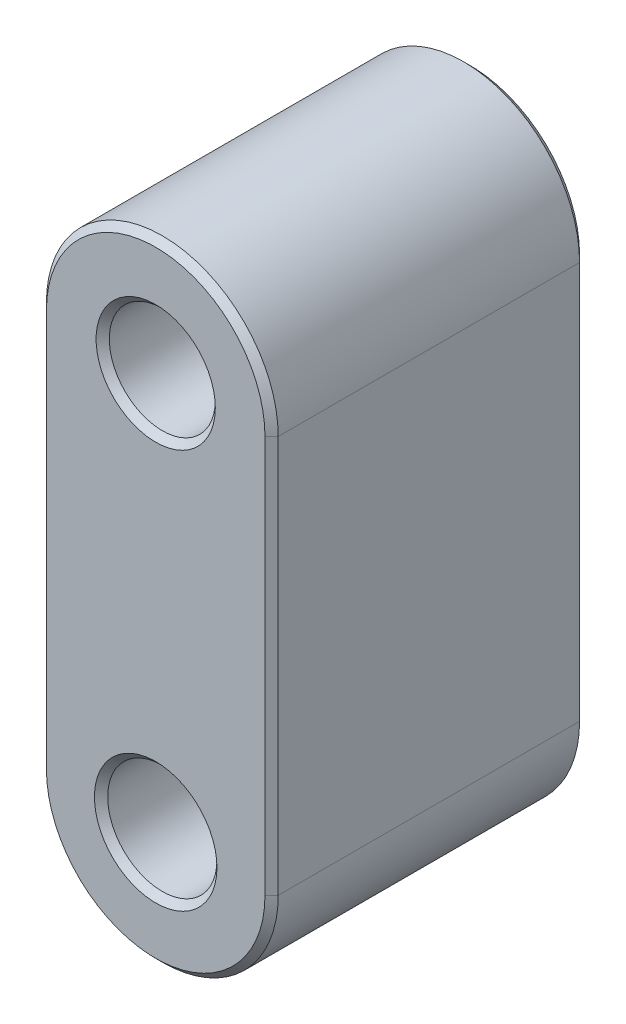
ISO-10303-21;
HEADER;
FILE_DESCRIPTION(('STEP AP214'),'2;1');
FILE_NAME('part.step','',(''),(''),'','','');
FILE_SCHEMA(('AUTOMOTIVE_DESIGN { 1 0 10303 214 1 1 1 1 }'));
ENDSEC;
DATA;
#1=APPLICATION_CONTEXT('core data for automotive mechanical design processes');
#2=APPLICATION_PROTOCOL_DEFINITION('international standard','automotive_design',2000,#1);
#3=PRODUCT_CONTEXT('',#1,'mechanical');
#4=PRODUCT('Part','Part','',(#3));
#5=PRODUCT_RELATED_PRODUCT_CATEGORY('part','',(#4));
#6=PRODUCT_DEFINITION_FORMATION('','',#4);
#7=PRODUCT_DEFINITION_CONTEXT('part definition',#1,'design');
#8=PRODUCT_DEFINITION('design','',#6,#7);
#9=PRODUCT_DEFINITION_SHAPE('','',#8);
#10=(LENGTH_UNIT() NAMED_UNIT(*) SI_UNIT(.MILLI.,.METRE.));
#11=(NAMED_UNIT(*) PLANE_ANGLE_UNIT() SI_UNIT($,.RADIAN.));
#12=(NAMED_UNIT(*) SI_UNIT($,.STERADIAN.) SOLID_ANGLE_UNIT());
#13=UNCERTAINTY_MEASURE_WITH_UNIT(LENGTH_MEASURE(1.E-05),#10,'distance_accuracy_value','');
#14=(GEOMETRIC_REPRESENTATION_CONTEXT(3) GLOBAL_UNCERTAINTY_ASSIGNED_CONTEXT((#13)) GLOBAL_UNIT_ASSIGNED_CONTEXT((#10,
#11,#12)) REPRESENTATION_CONTEXT('',''));
#15=CARTESIAN_POINT('',(0.,0.,0.));
#16=DIRECTION('',(0.,0.,1.));
#17=DIRECTION('',(1.,0.,0.));
#18=AXIS2_PLACEMENT_3D('',#15,#16,#17);
#19=CARTESIAN_POINT('',(-3.5,0.,4.75));
#20=DIRECTION('',(1.,0.,0.));
#21=DIRECTION('',(0.,0.,-1.));
#22=AXIS2_PLACEMENT_3D('',#19,#20,#21);
#23=PLANE('',#22);
#24=DIRECTION('',(0.,0.,-1.));
#25=VECTOR('',#24,1.);
#26=CARTESIAN_POINT('',(-3.5,0.,4.75));
#27=LINE('',#26,#25);
#28=CARTESIAN_POINT('',(-3.5,0.,4.55));
#29=VERTEX_POINT('',#28);
#30=CARTESIAN_POINT('',(-3.5,0.,-4.55));
#31=VERTEX_POINT('',#30);
#32=EDGE_CURVE('E167',#29,#31,#27,.T.);
#33=ORIENTED_EDGE('',*,*,#32,.T.);
#34=DIRECTION('',(0.,-1.,0.));
#35=VECTOR('',#34,1.);
#36=CARTESIAN_POINT('',(-3.5,0.,-4.55));
#37=LINE('',#36,#35);
#38=CARTESIAN_POINT('',(-3.5,-12.,-4.55));
#39=VERTEX_POINT('',#38);
#40=EDGE_CURVE('E210',#31,#39,#37,.T.);
#41=ORIENTED_EDGE('',*,*,#40,.T.);
#42=DIRECTION('',(0.,0.,-1.));
#43=VECTOR('',#42,1.);
#44=CARTESIAN_POINT('',(-3.5,-12.,4.75));
#45=LINE('',#44,#43);
#46=CARTESIAN_POINT('',(-3.5,-12.,4.55));
#47=VERTEX_POINT('',#46);
#48=EDGE_CURVE('E137',#47,#39,#45,.T.);
#49=ORIENTED_EDGE('',*,*,#48,.F.);
#50=DIRECTION('',(0.,1.,0.));
#51=VECTOR('',#50,1.);
#52=CARTESIAN_POINT('',(-3.5,0.,4.55));
#53=LINE('',#52,#51);
#54=EDGE_CURVE('E207',#47,#29,#53,.T.);
#55=ORIENTED_EDGE('',*,*,#54,.T.);
#56=EDGE_LOOP('',(#33,#41,#49,#55));
#57=FACE_BOUND('',#56,.T.);
#58=ADVANCED_FACE('F50',(#57),#23,.F.);
#59=CARTESIAN_POINT('',(0.,-12.,4.75));
#60=DIRECTION('',(0.,0.,-1.));
#61=DIRECTION('',(-1.,0.,0.));
#62=AXIS2_PLACEMENT_3D('',#59,#60,#61);
#63=CYLINDRICAL_SURFACE('',#62,3.5);
#64=ORIENTED_EDGE('',*,*,#48,.T.);
#65=CARTESIAN_POINT('',(0.,-12.,-4.55));
#66=DIRECTION('',(0.,0.,1.));
#67=DIRECTION('',(1.,0.,0.));
#68=AXIS2_PLACEMENT_3D('',#65,#66,#67);
#69=CIRCLE('',#68,3.5);
#70=CARTESIAN_POINT('',(3.5,-12.,-4.55));
#71=VERTEX_POINT('',#70);
#72=EDGE_CURVE('E140',#39,#71,#69,.T.);
#73=ORIENTED_EDGE('',*,*,#72,.T.);
#74=DIRECTION('',(0.,0.,-1.));
#75=VECTOR('',#74,1.);
#76=CARTESIAN_POINT('',(3.5,-12.,4.75));
#77=LINE('',#76,#75);
#78=CARTESIAN_POINT('',(3.5,-12.,4.55));
#79=VERTEX_POINT('',#78);
#80=EDGE_CURVE('E116',#79,#71,#77,.T.);
#81=ORIENTED_EDGE('',*,*,#80,.F.);
#82=CARTESIAN_POINT('',(0.,-12.,4.55));
#83=DIRECTION('',(0.,0.,1.));
#84=DIRECTION('',(1.,0.,0.));
#85=AXIS2_PLACEMENT_3D('',#82,#83,#84);
#86=CIRCLE('',#85,3.5);
#87=EDGE_CURVE('E134',#79,#47,#86,.F.);
#88=ORIENTED_EDGE('',*,*,#87,.T.);
#89=EDGE_LOOP('',(#64,#73,#81,#88));
#90=FACE_BOUND('',#89,.T.);
#91=ADVANCED_FACE('F131',(#90),#63,.T.);
#92=CARTESIAN_POINT('',(3.5,0.,4.75));
#93=DIRECTION('',(-1.,0.,0.));
#94=DIRECTION('',(0.,0.,1.));
#95=AXIS2_PLACEMENT_3D('',#92,#93,#94);
#96=PLANE('',#95);
#97=ORIENTED_EDGE('',*,*,#80,.T.);
#98=DIRECTION('',(0.,1.,0.));
#99=VECTOR('',#98,1.);
#100=CARTESIAN_POINT('',(3.5,0.,-4.55));
#101=LINE('',#100,#99);
#102=CARTESIAN_POINT('',(3.5,0.,-4.55));
#103=VERTEX_POINT('',#102);
#104=EDGE_CURVE('E127',#71,#103,#101,.T.);
#105=ORIENTED_EDGE('',*,*,#104,.T.);
#106=DIRECTION('',(0.,0.,-1.));
#107=VECTOR('',#106,1.);
#108=CARTESIAN_POINT('',(3.5,0.,4.75));
#109=LINE('',#108,#107);
#110=CARTESIAN_POINT('',(3.5,0.,4.55));
#111=VERTEX_POINT('',#110);
#112=EDGE_CURVE('E119',#111,#103,#109,.T.);
#113=ORIENTED_EDGE('',*,*,#112,.F.);
#114=DIRECTION('',(0.,-1.,0.));
#115=VECTOR('',#114,1.);
#116=CARTESIAN_POINT('',(3.5,-12.,4.55));
#117=LINE('',#116,#115);
#118=EDGE_CURVE('E113',#111,#79,#117,.T.);
#119=ORIENTED_EDGE('',*,*,#118,.T.);
#120=EDGE_LOOP('',(#97,#105,#113,#119));
#121=FACE_BOUND('',#120,.T.);
#122=ADVANCED_FACE('F120',(#121),#96,.F.);
#123=CARTESIAN_POINT('',(0.,-12.,4.75));
#124=DIRECTION('',(0.,0.,-1.));
#125=DIRECTION('',(-1.,0.,0.));
#126=AXIS2_PLACEMENT_3D('',#123,#124,#125);
#127=CYLINDRICAL_SURFACE('',#126,1.65);
#128=CARTESIAN_POINT('',(0.,-12.,-4.55));
#129=DIRECTION('',(0.,0.,1.));
#130=DIRECTION('',(1.,0.,0.));
#131=AXIS2_PLACEMENT_3D('',#128,#129,#130);
#132=CIRCLE('',#131,1.65);
#133=CARTESIAN_POINT('',(1.65,-12.,-4.55));
#134=VERTEX_POINT('',#133);
#135=EDGE_CURVE('E200',#134,#134,#132,.F.);
#136=ORIENTED_EDGE('',*,*,#135,.T.);
#137=EDGE_LOOP('',(#136));
#138=FACE_BOUND('',#137,.T.);
#139=CARTESIAN_POINT('',(0.,-12.,4.55));
#140=DIRECTION('',(0.,0.,1.));
#141=DIRECTION('',(1.,0.,0.));
#142=AXIS2_PLACEMENT_3D('',#139,#140,#141);
#143=CIRCLE('',#142,1.65);
#144=CARTESIAN_POINT('',(1.65,-12.,4.55));
#145=VERTEX_POINT('',#144);
#146=EDGE_CURVE('E201',#145,#145,#143,.T.);
#147=ORIENTED_EDGE('',*,*,#146,.T.);
#148=EDGE_LOOP('',(#147));
#149=FACE_BOUND('',#148,.T.);
#150=ADVANCED_FACE('F293',(#138,#149),#127,.F.);
#151=CARTESIAN_POINT('',(0.,0.,4.75));
#152=DIRECTION('',(0.,0.,-1.));
#153=DIRECTION('',(-1.,0.,0.));
#154=AXIS2_PLACEMENT_3D('',#151,#152,#153);
#155=CYLINDRICAL_SURFACE('',#154,1.6);
#156=CARTESIAN_POINT('',(0.,0.,-4.55));
#157=DIRECTION('',(0.,0.,1.));
#158=DIRECTION('',(1.,0.,0.));
#159=AXIS2_PLACEMENT_3D('',#156,#157,#158);
#160=CIRCLE('',#159,1.6);
#161=CARTESIAN_POINT('',(1.6,0.,-4.55));
#162=VERTEX_POINT('',#161);
#163=EDGE_CURVE('E193',#162,#162,#160,.F.);
#164=ORIENTED_EDGE('',*,*,#163,.T.);
#165=EDGE_LOOP('',(#164));
#166=FACE_BOUND('',#165,.T.);
#167=CARTESIAN_POINT('',(0.,0.,4.55000000000001));
#168=DIRECTION('',(0.,0.,1.));
#169=DIRECTION('',(1.,0.,0.));
#170=AXIS2_PLACEMENT_3D('',#167,#168,#169);
#171=CIRCLE('',#170,1.6);
#172=CARTESIAN_POINT('',(1.6,0.,4.55000000000001));
#173=VERTEX_POINT('',#172);
#174=EDGE_CURVE('E194',#173,#173,#171,.T.);
#175=ORIENTED_EDGE('',*,*,#174,.T.);
#176=EDGE_LOOP('',(#175));
#177=FACE_BOUND('',#176,.T.);
#178=ADVANCED_FACE('F296',(#166,#177),#155,.F.);
#179=CARTESIAN_POINT('',(0.,0.,4.75));
#180=DIRECTION('',(0.,0.,-1.));
#181=DIRECTION('',(-1.,0.,0.));
#182=AXIS2_PLACEMENT_3D('',#179,#180,#181);
#183=CYLINDRICAL_SURFACE('',#182,3.5);
#184=ORIENTED_EDGE('',*,*,#112,.T.);
#185=CARTESIAN_POINT('',(0.,0.,-4.55));
#186=DIRECTION('',(0.,0.,1.));
#187=DIRECTION('',(1.,0.,0.));
#188=AXIS2_PLACEMENT_3D('',#185,#186,#187);
#189=CIRCLE('',#188,3.5);
#190=EDGE_CURVE('E215',#103,#31,#189,.T.);
#191=ORIENTED_EDGE('',*,*,#190,.T.);
#192=ORIENTED_EDGE('',*,*,#32,.F.);
#193=CARTESIAN_POINT('',(0.,0.,4.55));
#194=DIRECTION('',(0.,0.,1.));
#195=DIRECTION('',(1.,0.,0.));
#196=AXIS2_PLACEMENT_3D('',#193,#194,#195);
#197=CIRCLE('',#196,3.5);
#198=EDGE_CURVE('E214',#29,#111,#197,.F.);
#199=ORIENTED_EDGE('',*,*,#198,.T.);
#200=EDGE_LOOP('',(#184,#191,#192,#199));
#201=FACE_BOUND('',#200,.T.);
#202=ADVANCED_FACE('F269',(#201),#183,.T.);
#203=CARTESIAN_POINT('',(0.,0.,4.75));
#204=DIRECTION('',(0.,0.,1.));
#205=DIRECTION('',(1.,0.,0.));
#206=AXIS2_PLACEMENT_3D('',#203,#204,#205);
#207=PLANE('',#206);
#208=DIRECTION('',(0.,1.,0.));
#209=VECTOR('',#208,1.);
#210=CARTESIAN_POINT('',(3.3,0.,4.75));
#211=LINE('',#210,#209);
#212=CARTESIAN_POINT('',(3.3,-12.,4.75));
#213=VERTEX_POINT('',#212);
#214=CARTESIAN_POINT('',(3.3,0.,4.75));
#215=VERTEX_POINT('',#214);
#216=EDGE_CURVE('E59',#213,#215,#211,.T.);
#217=ORIENTED_EDGE('',*,*,#216,.T.);
#218=CARTESIAN_POINT('',(0.,0.,4.75));
#219=DIRECTION('',(0.,0.,1.));
#220=DIRECTION('',(1.,0.,0.));
#221=AXIS2_PLACEMENT_3D('',#218,#219,#220);
#222=CIRCLE('',#221,3.3);
#223=CARTESIAN_POINT('',(-3.3,0.,4.75));
#224=VERTEX_POINT('',#223);
#225=EDGE_CURVE('E11',#215,#224,#222,.T.);
#226=ORIENTED_EDGE('',*,*,#225,.T.);
#227=DIRECTION('',(0.,-1.,0.));
#228=VECTOR('',#227,1.);
#229=CARTESIAN_POINT('',(-3.3,-12.,4.75));
#230=LINE('',#229,#228);
#231=CARTESIAN_POINT('',(-3.3,-12.,4.75));
#232=VERTEX_POINT('',#231);
#233=EDGE_CURVE('E179',#224,#232,#230,.T.);
#234=ORIENTED_EDGE('',*,*,#233,.T.);
#235=CARTESIAN_POINT('',(0.,-12.,4.75));
#236=DIRECTION('',(0.,0.,1.));
#237=DIRECTION('',(1.,0.,0.));
#238=AXIS2_PLACEMENT_3D('',#235,#236,#237);
#239=CIRCLE('',#238,3.3);
#240=EDGE_CURVE('E67',#232,#213,#239,.T.);
#241=ORIENTED_EDGE('',*,*,#240,.T.);
#242=EDGE_LOOP('',(#217,#226,#234,#241));
#243=FACE_BOUND('',#242,.T.);
#244=CARTESIAN_POINT('',(0.,-12.,4.75));
#245=DIRECTION('',(0.,0.,1.));
#246=DIRECTION('',(1.,0.,0.));
#247=AXIS2_PLACEMENT_3D('',#244,#245,#246);
#248=CIRCLE('',#247,1.85);
#249=CARTESIAN_POINT('',(1.85,-12.,4.75));
#250=VERTEX_POINT('',#249);
#251=EDGE_CURVE('E181',#250,#250,#248,.F.);
#252=ORIENTED_EDGE('',*,*,#251,.T.);
#253=EDGE_LOOP('',(#252));
#254=FACE_BOUND('',#253,.T.);
#255=CARTESIAN_POINT('',(0.,0.,4.75));
#256=DIRECTION('',(0.,0.,1.));
#257=DIRECTION('',(1.,0.,0.));
#258=AXIS2_PLACEMENT_3D('',#255,#256,#257);
#259=CIRCLE('',#258,1.8);
#260=CARTESIAN_POINT('',(1.8,0.,4.75));
#261=VERTEX_POINT('',#260);
#262=EDGE_CURVE('E190',#261,#261,#259,.F.);
#263=ORIENTED_EDGE('',*,*,#262,.T.);
#264=EDGE_LOOP('',(#263));
#265=FACE_BOUND('',#264,.T.);
#266=ADVANCED_FACE('F274',(#243,#254,#265),#207,.T.);
#267=CARTESIAN_POINT('',(0.,0.,-4.75));
#268=DIRECTION('',(0.,0.,1.));
#269=DIRECTION('',(1.,0.,0.));
#270=AXIS2_PLACEMENT_3D('',#267,#268,#269);
#271=PLANE('',#270);
#272=DIRECTION('',(0.,-1.,0.));
#273=VECTOR('',#272,1.);
#274=CARTESIAN_POINT('',(3.3,0.,-4.75));
#275=LINE('',#274,#273);
#276=CARTESIAN_POINT('',(3.3,0.,-4.75));
#277=VERTEX_POINT('',#276);
#278=CARTESIAN_POINT('',(3.3,-12.,-4.75));
#279=VERTEX_POINT('',#278);
#280=EDGE_CURVE('E224',#277,#279,#275,.T.);
#281=ORIENTED_EDGE('',*,*,#280,.T.);
#282=CARTESIAN_POINT('',(0.,-12.,-4.75));
#283=DIRECTION('',(0.,0.,1.));
#284=DIRECTION('',(1.,0.,0.));
#285=AXIS2_PLACEMENT_3D('',#282,#283,#284);
#286=CIRCLE('',#285,3.3);
#287=CARTESIAN_POINT('',(-3.3,-12.,-4.75));
#288=VERTEX_POINT('',#287);
#289=EDGE_CURVE('E130',#279,#288,#286,.F.);
#290=ORIENTED_EDGE('',*,*,#289,.T.);
#291=DIRECTION('',(0.,1.,0.));
#292=VECTOR('',#291,1.);
#293=CARTESIAN_POINT('',(-3.3,0.,-4.75));
#294=LINE('',#293,#292);
#295=CARTESIAN_POINT('',(-3.3,0.,-4.75));
#296=VERTEX_POINT('',#295);
#297=EDGE_CURVE('E226',#288,#296,#294,.T.);
#298=ORIENTED_EDGE('',*,*,#297,.T.);
#299=CARTESIAN_POINT('',(0.,0.,-4.75));
#300=DIRECTION('',(0.,0.,1.));
#301=DIRECTION('',(1.,0.,0.));
#302=AXIS2_PLACEMENT_3D('',#299,#300,#301);
#303=CIRCLE('',#302,3.3);
#304=EDGE_CURVE('E228',#296,#277,#303,.F.);
#305=ORIENTED_EDGE('',*,*,#304,.T.);
#306=EDGE_LOOP('',(#281,#290,#298,#305));
#307=FACE_BOUND('',#306,.T.);
#308=CARTESIAN_POINT('',(0.,-12.,-4.75));
#309=DIRECTION('',(0.,0.,1.));
#310=DIRECTION('',(1.,0.,0.));
#311=AXIS2_PLACEMENT_3D('',#308,#309,#310);
#312=CIRCLE('',#311,1.85);
#313=CARTESIAN_POINT('',(1.85,-12.,-4.75));
#314=VERTEX_POINT('',#313);
#315=EDGE_CURVE('E231',#314,#314,#312,.T.);
#316=ORIENTED_EDGE('',*,*,#315,.T.);
#317=EDGE_LOOP('',(#316));
#318=FACE_BOUND('',#317,.T.);
#319=CARTESIAN_POINT('',(0.,0.,-4.75));
#320=DIRECTION('',(0.,0.,1.));
#321=DIRECTION('',(1.,0.,0.));
#322=AXIS2_PLACEMENT_3D('',#319,#320,#321);
#323=CIRCLE('',#322,1.8);
#324=CARTESIAN_POINT('',(1.8,0.,-4.75));
#325=VERTEX_POINT('',#324);
#326=EDGE_CURVE('E234',#325,#325,#323,.T.);
#327=ORIENTED_EDGE('',*,*,#326,.T.);
#328=EDGE_LOOP('',(#327));
#329=FACE_BOUND('',#328,.T.);
#330=ADVANCED_FACE('F324',(#307,#318,#329),#271,.F.);
#331=CARTESIAN_POINT('',(0.,0.,-4.75));
#332=DIRECTION('',(0.,0.,1.));
#333=DIRECTION('',(1.,0.,0.));
#334=AXIS2_PLACEMENT_3D('',#331,#332,#333);
#335=CONICAL_SURFACE('',#334,3.3,0.785398163397457);
#336=DIRECTION('',(0.707106781186554,0.,0.707106781186541));
#337=VECTOR('',#336,1.);
#338=CARTESIAN_POINT('',(3.3,0.,-4.75));
#339=LINE('',#338,#337);
#340=EDGE_CURVE('E170',#277,#103,#339,.T.);
#341=ORIENTED_EDGE('',*,*,#340,.F.);
#342=ORIENTED_EDGE('',*,*,#304,.F.);
#343=DIRECTION('',(0.707106781186554,0.,-0.707106781186541));
#344=VECTOR('',#343,1.);
#345=CARTESIAN_POINT('',(-3.5,0.,-4.55));
#346=LINE('',#345,#344);
#347=EDGE_CURVE('E165',#31,#296,#346,.T.);
#348=ORIENTED_EDGE('',*,*,#347,.F.);
#349=ORIENTED_EDGE('',*,*,#190,.F.);
#350=EDGE_LOOP('',(#341,#342,#348,#349));
#351=FACE_BOUND('',#350,.T.);
#352=ADVANCED_FACE('F260',(#351),#335,.T.);
#353=CARTESIAN_POINT('',(-3.5,0.,-4.55));
#354=DIRECTION('',(0.707106781186541,0.,0.707106781186554));
#355=DIRECTION('',(0.,-1.,0.));
#356=AXIS2_PLACEMENT_3D('',#353,#354,#355);
#357=PLANE('',#356);
#358=ORIENTED_EDGE('',*,*,#347,.T.);
#359=ORIENTED_EDGE('',*,*,#297,.F.);
#360=DIRECTION('',(0.707106781186554,0.,-0.707106781186541));
#361=VECTOR('',#360,1.);
#362=CARTESIAN_POINT('',(-3.5,-12.,-4.55));
#363=LINE('',#362,#361);
#364=EDGE_CURVE('E173',#39,#288,#363,.T.);
#365=ORIENTED_EDGE('',*,*,#364,.F.);
#366=ORIENTED_EDGE('',*,*,#40,.F.);
#367=EDGE_LOOP('',(#358,#359,#365,#366));
#368=FACE_BOUND('',#367,.T.);
#369=ADVANCED_FACE('F261',(#368),#357,.F.);
#370=CARTESIAN_POINT('',(3.5,0.,-4.55));
#371=DIRECTION('',(-0.707106781186541,0.,0.707106781186554));
#372=DIRECTION('',(0.,1.,0.));
#373=AXIS2_PLACEMENT_3D('',#370,#371,#372);
#374=PLANE('',#373);
#375=ORIENTED_EDGE('',*,*,#340,.T.);
#376=ORIENTED_EDGE('',*,*,#104,.F.);
#377=DIRECTION('',(0.707106781186554,0.,0.707106781186541));
#378=VECTOR('',#377,1.);
#379=CARTESIAN_POINT('',(3.3,-12.,-4.75));
#380=LINE('',#379,#378);
#381=EDGE_CURVE('E154',#279,#71,#380,.T.);
#382=ORIENTED_EDGE('',*,*,#381,.F.);
#383=ORIENTED_EDGE('',*,*,#280,.F.);
#384=EDGE_LOOP('',(#375,#376,#382,#383));
#385=FACE_BOUND('',#384,.T.);
#386=ADVANCED_FACE('F267',(#385),#374,.F.);
#387=CARTESIAN_POINT('',(0.,-12.,-4.55));
#388=DIRECTION('',(0.,0.,1.));
#389=DIRECTION('',(1.,0.,0.));
#390=AXIS2_PLACEMENT_3D('',#387,#388,#389);
#391=CONICAL_SURFACE('',#390,3.5,0.785398163397457);
#392=ORIENTED_EDGE('',*,*,#364,.T.);
#393=ORIENTED_EDGE('',*,*,#289,.F.);
#394=ORIENTED_EDGE('',*,*,#381,.T.);
#395=ORIENTED_EDGE('',*,*,#72,.F.);
#396=EDGE_LOOP('',(#392,#393,#394,#395));
#397=FACE_BOUND('',#396,.T.);
#398=ADVANCED_FACE('F262',(#397),#391,.T.);
#399=CARTESIAN_POINT('',(0.,-12.,-4.75));
#400=DIRECTION('',(0.,0.,-1.));
#401=DIRECTION('',(-1.,0.,0.));
#402=AXIS2_PLACEMENT_3D('',#399,#400,#401);
#403=CONICAL_SURFACE('',#402,1.85,0.785398163397444);
#404=ORIENTED_EDGE('',*,*,#135,.F.);
#405=EDGE_LOOP('',(#404));
#406=FACE_BOUND('',#405,.T.);
#407=ORIENTED_EDGE('',*,*,#315,.F.);
#408=EDGE_LOOP('',(#407));
#409=FACE_BOUND('',#408,.T.);
#410=ADVANCED_FACE('F309',(#406,#409),#403,.F.);
#411=CARTESIAN_POINT('',(0.,0.,-4.75));
#412=DIRECTION('',(0.,0.,-1.));
#413=DIRECTION('',(-1.,0.,0.));
#414=AXIS2_PLACEMENT_3D('',#411,#412,#413);
#415=CONICAL_SURFACE('',#414,1.8,0.785398163397446);
#416=ORIENTED_EDGE('',*,*,#163,.F.);
#417=EDGE_LOOP('',(#416));
#418=FACE_BOUND('',#417,.T.);
#419=ORIENTED_EDGE('',*,*,#326,.F.);
#420=EDGE_LOOP('',(#419));
#421=FACE_BOUND('',#420,.T.);
#422=ADVANCED_FACE('F284',(#418,#421),#415,.F.);
#423=CARTESIAN_POINT('',(0.,-12.,4.75));
#424=DIRECTION('',(0.,0.,-1.));
#425=DIRECTION('',(-1.,0.,0.));
#426=AXIS2_PLACEMENT_3D('',#423,#424,#425);
#427=CONICAL_SURFACE('',#426,3.3,0.78539816339744);
#428=DIRECTION('',(0.707106781186541,0.,-0.707106781186554));
#429=VECTOR('',#428,1.);
#430=CARTESIAN_POINT('',(3.3,-12.,4.75));
#431=LINE('',#430,#429);
#432=EDGE_CURVE('E145',#213,#79,#431,.T.);
#433=ORIENTED_EDGE('',*,*,#432,.F.);
#434=ORIENTED_EDGE('',*,*,#240,.F.);
#435=DIRECTION('',(0.707106781186541,0.,0.707106781186554));
#436=VECTOR('',#435,1.);
#437=CARTESIAN_POINT('',(-3.5,-12.,4.55));
#438=LINE('',#437,#436);
#439=EDGE_CURVE('E55',#47,#232,#438,.T.);
#440=ORIENTED_EDGE('',*,*,#439,.F.);
#441=ORIENTED_EDGE('',*,*,#87,.F.);
#442=EDGE_LOOP('',(#433,#434,#440,#441));
#443=FACE_BOUND('',#442,.T.);
#444=ADVANCED_FACE('F141',(#443),#427,.T.);
#445=CARTESIAN_POINT('',(-3.3,0.,4.75));
#446=DIRECTION('',(-0.707106781186554,0.,0.707106781186541));
#447=DIRECTION('',(0.,1.,0.));
#448=AXIS2_PLACEMENT_3D('',#445,#446,#447);
#449=PLANE('',#448);
#450=ORIENTED_EDGE('',*,*,#439,.T.);
#451=ORIENTED_EDGE('',*,*,#233,.F.);
#452=DIRECTION('',(0.707106781186541,0.,0.707106781186554));
#453=VECTOR('',#452,1.);
#454=CARTESIAN_POINT('',(-3.5,0.,4.55));
#455=LINE('',#454,#453);
#456=EDGE_CURVE('E151',#29,#224,#455,.T.);
#457=ORIENTED_EDGE('',*,*,#456,.F.);
#458=ORIENTED_EDGE('',*,*,#54,.F.);
#459=EDGE_LOOP('',(#450,#451,#457,#458));
#460=FACE_BOUND('',#459,.T.);
#461=ADVANCED_FACE('F279',(#460),#449,.T.);
#462=CARTESIAN_POINT('',(3.3,0.,4.75));
#463=DIRECTION('',(0.707106781186554,0.,0.707106781186541));
#464=DIRECTION('',(0.,-1.,0.));
#465=AXIS2_PLACEMENT_3D('',#462,#463,#464);
#466=PLANE('',#465);
#467=ORIENTED_EDGE('',*,*,#432,.T.);
#468=ORIENTED_EDGE('',*,*,#118,.F.);
#469=DIRECTION('',(0.707106781186541,0.,-0.707106781186554));
#470=VECTOR('',#469,1.);
#471=CARTESIAN_POINT('',(3.3,0.,4.75));
#472=LINE('',#471,#470);
#473=EDGE_CURVE('E160',#215,#111,#472,.T.);
#474=ORIENTED_EDGE('',*,*,#473,.F.);
#475=ORIENTED_EDGE('',*,*,#216,.F.);
#476=EDGE_LOOP('',(#467,#468,#474,#475));
#477=FACE_BOUND('',#476,.T.);
#478=ADVANCED_FACE('F149',(#477),#466,.T.);
#479=CARTESIAN_POINT('',(0.,0.,4.55));
#480=DIRECTION('',(0.,0.,-1.));
#481=DIRECTION('',(-1.,0.,0.));
#482=AXIS2_PLACEMENT_3D('',#479,#480,#481);
#483=CONICAL_SURFACE('',#482,3.5,0.78539816339744);
#484=ORIENTED_EDGE('',*,*,#456,.T.);
#485=ORIENTED_EDGE('',*,*,#225,.F.);
#486=ORIENTED_EDGE('',*,*,#473,.T.);
#487=ORIENTED_EDGE('',*,*,#198,.F.);
#488=EDGE_LOOP('',(#484,#485,#486,#487));
#489=FACE_BOUND('',#488,.T.);
#490=ADVANCED_FACE('F272',(#489),#483,.T.);
#491=CARTESIAN_POINT('',(0.,-12.,4.55));
#492=DIRECTION('',(0.,0.,1.));
#493=DIRECTION('',(1.,0.,0.));
#494=AXIS2_PLACEMENT_3D('',#491,#492,#493);
#495=CONICAL_SURFACE('',#494,1.65,0.785398163397461);
#496=ORIENTED_EDGE('',*,*,#251,.F.);
#497=EDGE_LOOP('',(#496));
#498=FACE_BOUND('',#497,.T.);
#499=ORIENTED_EDGE('',*,*,#146,.F.);
#500=EDGE_LOOP('',(#499));
#501=FACE_BOUND('',#500,.T.);
#502=ADVANCED_FACE('F342',(#498,#501),#495,.F.);
#503=CARTESIAN_POINT('',(0.,0.,4.55000000000001));
#504=DIRECTION('',(0.,0.,1.));
#505=DIRECTION('',(1.,0.,0.));
#506=AXIS2_PLACEMENT_3D('',#503,#504,#505);
#507=CONICAL_SURFACE('',#506,1.6,0.785398163397454);
#508=CARTESIAN_POINT('',(1.8,0.,4.75));
#509=CARTESIAN_POINT('',(1.79791666666666,0.,4.74791666666667));
#510=CARTESIAN_POINT('',(1.79583333333333,0.,4.74583333333333));
#511=CARTESIAN_POINT('',(1.79166666666666,0.,4.74166666666667));
#512=CARTESIAN_POINT('',(1.78958333333333,0.,4.73958333333333));
#513=CARTESIAN_POINT('',(1.78541666666666,0.,4.73541666666667));
#514=CARTESIAN_POINT('',(1.78333333333333,0.,4.73333333333333));
#515=CARTESIAN_POINT('',(1.77916666666666,0.,4.72916666666667));
#516=CARTESIAN_POINT('',(1.77708333333333,0.,4.72708333333333));
#517=CARTESIAN_POINT('',(1.77291666666666,0.,4.72291666666667));
#518=CARTESIAN_POINT('',(1.77083333333333,0.,4.72083333333333));
#519=CARTESIAN_POINT('',(1.76666666666666,0.,4.71666666666667));
#520=CARTESIAN_POINT('',(1.76458333333333,0.,4.71458333333333));
#521=CARTESIAN_POINT('',(1.76041666666666,0.,4.71041666666667));
#522=CARTESIAN_POINT('',(1.75833333333333,0.,4.70833333333333));
#523=CARTESIAN_POINT('',(1.75416666666666,0.,4.70416666666667));
#524=CARTESIAN_POINT('',(1.75208333333333,0.,4.70208333333333));
#525=CARTESIAN_POINT('',(1.74791666666666,0.,4.69791666666667));
#526=CARTESIAN_POINT('',(1.74583333333333,0.,4.69583333333333));
#527=CARTESIAN_POINT('',(1.74166666666666,0.,4.69166666666667));
#528=CARTESIAN_POINT('',(1.73958333333333,0.,4.68958333333333));
#529=CARTESIAN_POINT('',(1.73541666666666,0.,4.68541666666667));
#530=CARTESIAN_POINT('',(1.73333333333333,0.,4.68333333333333));
#531=CARTESIAN_POINT('',(1.72916666666666,0.,4.67916666666667));
#532=CARTESIAN_POINT('',(1.72708333333333,0.,4.67708333333333));
#533=CARTESIAN_POINT('',(1.72291666666666,0.,4.67291666666667));
#534=CARTESIAN_POINT('',(1.72083333333333,0.,4.67083333333334));
#535=CARTESIAN_POINT('',(1.71666666666666,0.,4.66666666666667));
#536=CARTESIAN_POINT('',(1.71458333333333,0.,4.66458333333334));
#537=CARTESIAN_POINT('',(1.71041666666666,0.,4.66041666666667));
#538=CARTESIAN_POINT('',(1.70833333333333,0.,4.65833333333334));
#539=CARTESIAN_POINT('',(1.70416666666666,0.,4.65416666666667));
#540=CARTESIAN_POINT('',(1.70208333333333,0.,4.65208333333334));
#541=CARTESIAN_POINT('',(1.69791666666666,0.,4.64791666666667));
#542=CARTESIAN_POINT('',(1.69583333333333,0.,4.64583333333334));
#543=CARTESIAN_POINT('',(1.69166666666666,0.,4.64166666666667));
#544=CARTESIAN_POINT('',(1.68958333333333,0.,4.63958333333334));
#545=CARTESIAN_POINT('',(1.68541666666666,0.,4.63541666666667));
#546=CARTESIAN_POINT('',(1.68333333333333,0.,4.63333333333334));
#547=CARTESIAN_POINT('',(1.67916666666666,0.,4.62916666666667));
#548=CARTESIAN_POINT('',(1.67708333333333,0.,4.62708333333334));
#549=CARTESIAN_POINT('',(1.67291666666667,0.,4.62291666666667));
#550=CARTESIAN_POINT('',(1.67083333333333,0.,4.62083333333334));
#551=CARTESIAN_POINT('',(1.66666666666666,0.,4.61666666666667));
#552=CARTESIAN_POINT('',(1.66458333333333,0.,4.61458333333334));
#553=CARTESIAN_POINT('',(1.66041666666667,0.,4.61041666666667));
#554=CARTESIAN_POINT('',(1.65833333333333,0.,4.60833333333334));
#555=CARTESIAN_POINT('',(1.65416666666667,0.,4.60416666666667));
#556=CARTESIAN_POINT('',(1.65208333333333,0.,4.60208333333334));
#557=CARTESIAN_POINT('',(1.64791666666667,0.,4.59791666666667));
#558=CARTESIAN_POINT('',(1.64583333333333,0.,4.59583333333334));
#559=CARTESIAN_POINT('',(1.64166666666667,0.,4.59166666666667));
#560=CARTESIAN_POINT('',(1.63958333333333,0.,4.58958333333334));
#561=CARTESIAN_POINT('',(1.63541666666667,0.,4.58541666666667));
#562=CARTESIAN_POINT('',(1.63333333333333,0.,4.58333333333334));
#563=CARTESIAN_POINT('',(1.62916666666667,0.,4.57916666666667));
#564=CARTESIAN_POINT('',(1.62708333333333,0.,4.57708333333334));
#565=CARTESIAN_POINT('',(1.62291666666667,0.,4.57291666666667));
#566=CARTESIAN_POINT('',(1.62083333333333,0.,4.57083333333334));
#567=CARTESIAN_POINT('',(1.61666666666667,0.,4.56666666666667));
#568=CARTESIAN_POINT('',(1.61458333333333,0.,4.56458333333334));
#569=CARTESIAN_POINT('',(1.61041666666667,0.,4.56041666666667));
#570=CARTESIAN_POINT('',(1.60833333333333,0.,4.55833333333334));
#571=CARTESIAN_POINT('',(1.60416666666667,0.,4.55416666666667));
#572=CARTESIAN_POINT('',(1.60208333333333,0.,4.55208333333334));
#573=CARTESIAN_POINT('',(1.6,0.,4.55000000000001));
#574=B_SPLINE_CURVE_WITH_KNOTS('',3,(#508,#509,#510,#511,#512,#513,#514,#515,#516,#517,#518,
#519,#520,#521,#522,#523,#524,#525,#526,#527,#528,#529,#530,#531,#532,#533,#534,#535,#536,#537,
#538,#539,#540,#541,#542,#543,#544,#545,#546,#547,#548,#549,#550,#551,#552,#553,#554,#555,#556,
#557,#558,#559,#560,#561,#562,#563,#564,#565,#566,#567,#568,#569,#570,#571,#572,#573),
.UNSPECIFIED.,.F.,.F.,(4,2,2,2,2,2,2,2,2,2,2,2,2,2,2,2,2,2,2,2,2,2,2,2,2,2,2,2,2,2,2,2,4),(0.,
0.00883883476483179,0.0176776695296637,0.0265165042944951,0.0353553390593269,0.0441941738241582,
0.05303300858899,0.0618718433538213,0.0707106781186531,0.079549512883485,0.0883883476483164,
0.0972271824131481,0.106066017177979,0.114904851942811,0.123743686707643,0.132582521472475,
0.141421356237306,0.150260191002138,0.15909902576697,0.167937860531801,0.176776695296633,
0.185615530061464,0.194454364826296,0.203293199591127,0.212132034355959,0.220970869120791,
0.229809703885622,0.238648538650454,0.247487373415285,0.256326208180117,0.265165042944948,
0.27400387770978,0.282842712474612),.UNSPECIFIED.);
#575=EDGE_CURVE('BSEAM49',#261,#173,#574,.T.);
#576=ORIENTED_EDGE('',*,*,#262,.F.);
#577=ORIENTED_EDGE('',*,*,#174,.F.);
#578=ORIENTED_EDGE('',*,*,#575,.T.);
#579=ORIENTED_EDGE('',*,*,#575,.F.);
#580=EDGE_LOOP('',(#576,#578,#577,#579));
#581=FACE_BOUND('',#580,.T.);
#582=ADVANCED_FACE('F49',(#581),#507,.F.);
#583=CLOSED_SHELL('',(#58,#91,#122,#150,#178,#202,#266,#330,#352,#369,#386,#398,#410,#422,#444,
#461,#478,#490,#502,#582));
#584=MANIFOLD_SOLID_BREP('B2',#583);
#585=ADVANCED_BREP_SHAPE_REPRESENTATION('',(#18,#584),#14);
#586=SHAPE_DEFINITION_REPRESENTATION(#9,#585);
ENDSEC;
END-ISO-10303-21;
